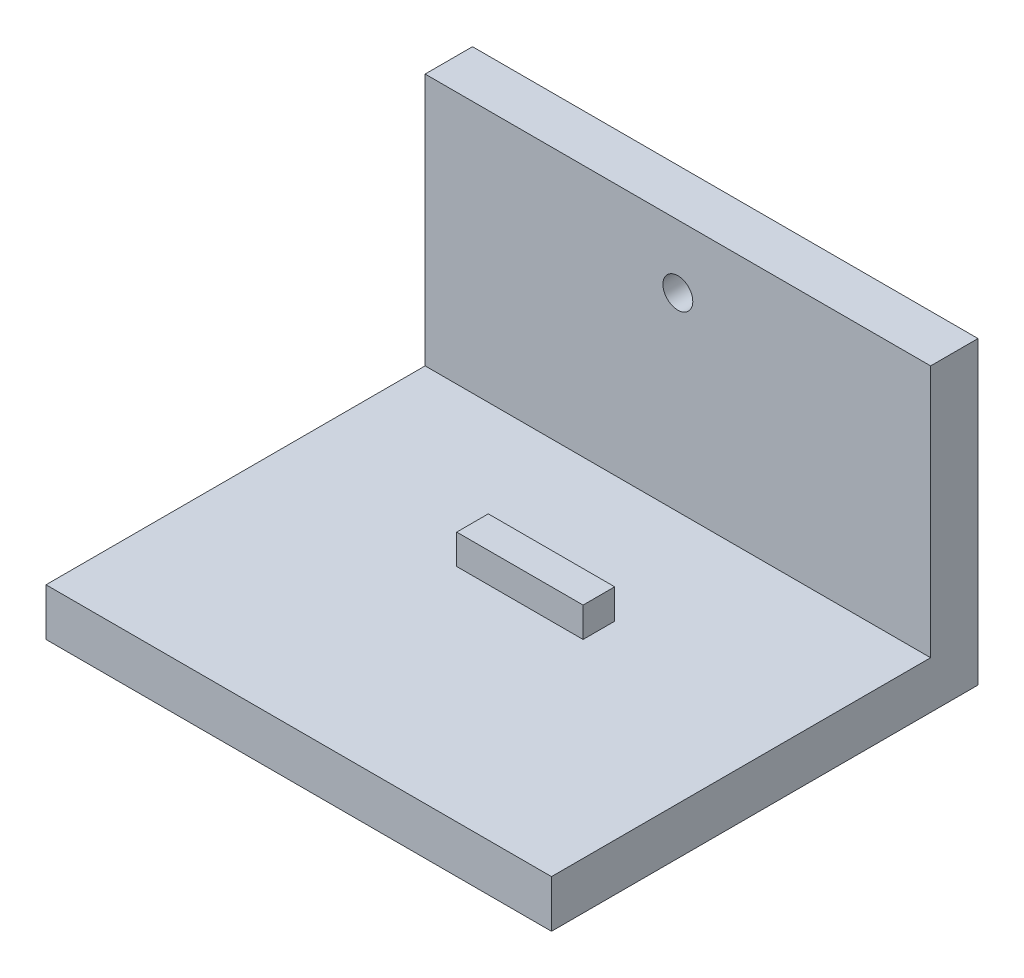
ISO-10303-21;
HEADER;
FILE_DESCRIPTION(('STEP AP214'),'2;1');
FILE_NAME('part.step','',(''),(''),'','','');
FILE_SCHEMA(('AUTOMOTIVE_DESIGN { 1 0 10303 214 1 1 1 1 }'));
ENDSEC;
DATA;
#1=APPLICATION_CONTEXT('core data for automotive mechanical design processes');
#2=APPLICATION_PROTOCOL_DEFINITION('international standard','automotive_design',2000,#1);
#3=PRODUCT_CONTEXT('',#1,'mechanical');
#4=PRODUCT('Part','Part','',(#3));
#5=PRODUCT_RELATED_PRODUCT_CATEGORY('part','',(#4));
#6=PRODUCT_DEFINITION_FORMATION('','',#4);
#7=PRODUCT_DEFINITION_CONTEXT('part definition',#1,'design');
#8=PRODUCT_DEFINITION('design','',#6,#7);
#9=PRODUCT_DEFINITION_SHAPE('','',#8);
#10=(LENGTH_UNIT() NAMED_UNIT(*) SI_UNIT(.MILLI.,.METRE.));
#11=(NAMED_UNIT(*) PLANE_ANGLE_UNIT() SI_UNIT($,.RADIAN.));
#12=(NAMED_UNIT(*) SI_UNIT($,.STERADIAN.) SOLID_ANGLE_UNIT());
#13=UNCERTAINTY_MEASURE_WITH_UNIT(LENGTH_MEASURE(1.E-05),#10,'distance_accuracy_value','');
#14=(GEOMETRIC_REPRESENTATION_CONTEXT(3) GLOBAL_UNCERTAINTY_ASSIGNED_CONTEXT((#13)) GLOBAL_UNIT_ASSIGNED_CONTEXT((#10,
#11,#12)) REPRESENTATION_CONTEXT('',''));
#15=CARTESIAN_POINT('',(0.,0.,0.));
#16=DIRECTION('',(0.,0.,1.));
#17=DIRECTION('',(1.,0.,0.));
#18=AXIS2_PLACEMENT_3D('',#15,#16,#17);
#19=CARTESIAN_POINT('',(50.8,4.7625,42.8625));
#20=DIRECTION('',(0.,-1.,0.));
#21=DIRECTION('',(0.,0.,-1.));
#22=AXIS2_PLACEMENT_3D('',#19,#20,#21);
#23=PLANE('',#22);
#24=DIRECTION('',(0.,0.,1.));
#25=VECTOR('',#24,1.);
#26=CARTESIAN_POINT('',(0.,4.7625,42.8625));
#27=LINE('',#26,#25);
#28=CARTESIAN_POINT('',(0.,4.7625,4.7625));
#29=VERTEX_POINT('',#28);
#30=CARTESIAN_POINT('',(0.,4.7625,42.8625));
#31=VERTEX_POINT('',#30);
#32=EDGE_CURVE('E178',#29,#31,#27,.T.);
#33=ORIENTED_EDGE('',*,*,#32,.T.);
#34=DIRECTION('',(-1.,0.,0.));
#35=VECTOR('',#34,1.);
#36=CARTESIAN_POINT('',(50.8,4.7625,42.8625));
#37=LINE('',#36,#35);
#38=CARTESIAN_POINT('',(50.8,4.7625,42.8625));
#39=VERTEX_POINT('',#38);
#40=EDGE_CURVE('E193',#39,#31,#37,.T.);
#41=ORIENTED_EDGE('',*,*,#40,.F.);
#42=DIRECTION('',(0.,0.,1.));
#43=VECTOR('',#42,1.);
#44=CARTESIAN_POINT('',(50.8,4.7625,42.8625));
#45=LINE('',#44,#43);
#46=CARTESIAN_POINT('',(50.8,4.7625,4.7625));
#47=VERTEX_POINT('',#46);
#48=EDGE_CURVE('E163',#47,#39,#45,.T.);
#49=ORIENTED_EDGE('',*,*,#48,.F.);
#50=DIRECTION('',(-1.,0.,0.));
#51=VECTOR('',#50,1.);
#52=CARTESIAN_POINT('',(50.8,4.7625,4.7625));
#53=LINE('',#52,#51);
#54=EDGE_CURVE('E197',#47,#29,#53,.T.);
#55=ORIENTED_EDGE('',*,*,#54,.T.);
#56=EDGE_LOOP('',(#33,#41,#49,#55));
#57=FACE_BOUND('',#56,.T.);
#58=DIRECTION('',(0.,0.,1.));
#59=VECTOR('',#58,1.);
#60=CARTESIAN_POINT('',(19.05,4.7625,20.6375));
#61=LINE('',#60,#59);
#62=CARTESIAN_POINT('',(19.05,4.7625,17.4625));
#63=VERTEX_POINT('',#62);
#64=CARTESIAN_POINT('',(19.05,4.7625,20.6375));
#65=VERTEX_POINT('',#64);
#66=EDGE_CURVE('E139',#63,#65,#61,.T.);
#67=ORIENTED_EDGE('',*,*,#66,.F.);
#68=DIRECTION('',(-1.,0.,0.));
#69=VECTOR('',#68,1.);
#70=CARTESIAN_POINT('',(19.05,4.7625,17.4625));
#71=LINE('',#70,#69);
#72=CARTESIAN_POINT('',(31.75,4.7625,17.4625));
#73=VERTEX_POINT('',#72);
#74=EDGE_CURVE('E136',#73,#63,#71,.T.);
#75=ORIENTED_EDGE('',*,*,#74,.F.);
#76=DIRECTION('',(0.,0.,-1.));
#77=VECTOR('',#76,1.);
#78=CARTESIAN_POINT('',(31.75,4.7625,20.6375));
#79=LINE('',#78,#77);
#80=CARTESIAN_POINT('',(31.75,4.7625,20.6375));
#81=VERTEX_POINT('',#80);
#82=EDGE_CURVE('E60',#81,#73,#79,.T.);
#83=ORIENTED_EDGE('',*,*,#82,.F.);
#84=DIRECTION('',(1.,0.,0.));
#85=VECTOR('',#84,1.);
#86=CARTESIAN_POINT('',(19.05,4.7625,20.6375));
#87=LINE('',#86,#85);
#88=EDGE_CURVE('E55',#65,#81,#87,.T.);
#89=ORIENTED_EDGE('',*,*,#88,.F.);
#90=EDGE_LOOP('',(#67,#75,#83,#89));
#91=FACE_BOUND('',#90,.T.);
#92=ADVANCED_FACE('F39',(#57,#91),#23,.F.);
#93=CARTESIAN_POINT('',(50.8,30.1625,0.));
#94=DIRECTION('',(0.,0.,1.));
#95=DIRECTION('',(0.,-1.,0.));
#96=AXIS2_PLACEMENT_3D('',#93,#94,#95);
#97=PLANE('',#96);
#98=CARTESIAN_POINT('',(25.4,23.8125,0.));
#99=DIRECTION('',(0.,0.,1.));
#100=DIRECTION('',(1.,0.,0.));
#101=AXIS2_PLACEMENT_3D('',#98,#99,#100);
#102=CIRCLE('',#101,1.499997);
#103=CARTESIAN_POINT('',(26.899997,23.8125,0.));
#104=VERTEX_POINT('',#103);
#105=EDGE_CURVE('E353',#104,#104,#102,.T.);
#106=ORIENTED_EDGE('',*,*,#105,.T.);
#107=EDGE_LOOP('',(#106));
#108=FACE_BOUND('',#107,.T.);
#109=DIRECTION('',(0.,1.,0.));
#110=VECTOR('',#109,1.);
#111=CARTESIAN_POINT('',(0.,30.1625,0.));
#112=LINE('',#111,#110);
#113=CARTESIAN_POINT('',(0.,0.,0.));
#114=VERTEX_POINT('',#113);
#115=CARTESIAN_POINT('',(0.,30.1625,0.));
#116=VERTEX_POINT('',#115);
#117=EDGE_CURVE('E141',#114,#116,#112,.T.);
#118=ORIENTED_EDGE('',*,*,#117,.T.);
#119=DIRECTION('',(-1.,0.,0.));
#120=VECTOR('',#119,1.);
#121=CARTESIAN_POINT('',(50.8,30.1625,0.));
#122=LINE('',#121,#120);
#123=CARTESIAN_POINT('',(50.8,30.1625,0.));
#124=VERTEX_POINT('',#123);
#125=EDGE_CURVE('E11',#124,#116,#122,.T.);
#126=ORIENTED_EDGE('',*,*,#125,.F.);
#127=DIRECTION('',(0.,1.,0.));
#128=VECTOR('',#127,1.);
#129=CARTESIAN_POINT('',(50.8,30.1625,0.));
#130=LINE('',#129,#128);
#131=CARTESIAN_POINT('',(50.8,0.,0.));
#132=VERTEX_POINT('',#131);
#133=EDGE_CURVE('E152',#132,#124,#130,.T.);
#134=ORIENTED_EDGE('',*,*,#133,.F.);
#135=DIRECTION('',(-1.,0.,0.));
#136=VECTOR('',#135,1.);
#137=CARTESIAN_POINT('',(50.8,0.,0.));
#138=LINE('',#137,#136);
#139=EDGE_CURVE('E171',#132,#114,#138,.T.);
#140=ORIENTED_EDGE('',*,*,#139,.T.);
#141=EDGE_LOOP('',(#118,#126,#134,#140));
#142=FACE_BOUND('',#141,.T.);
#143=ADVANCED_FACE('F41',(#108,#142),#97,.F.);
#144=CARTESIAN_POINT('',(50.8,30.1625,4.7625));
#145=DIRECTION('',(0.,-1.,0.));
#146=DIRECTION('',(0.,0.,-1.));
#147=AXIS2_PLACEMENT_3D('',#144,#145,#146);
#148=PLANE('',#147);
#149=DIRECTION('',(0.,0.,1.));
#150=VECTOR('',#149,1.);
#151=CARTESIAN_POINT('',(0.,30.1625,4.7625));
#152=LINE('',#151,#150);
#153=CARTESIAN_POINT('',(0.,30.1625,4.7625));
#154=VERTEX_POINT('',#153);
#155=EDGE_CURVE('E146',#116,#154,#152,.T.);
#156=ORIENTED_EDGE('',*,*,#155,.T.);
#157=DIRECTION('',(-1.,0.,0.));
#158=VECTOR('',#157,1.);
#159=CARTESIAN_POINT('',(50.8,30.1625,4.7625));
#160=LINE('',#159,#158);
#161=CARTESIAN_POINT('',(50.8,30.1625,4.7625));
#162=VERTEX_POINT('',#161);
#163=EDGE_CURVE('E48',#162,#154,#160,.T.);
#164=ORIENTED_EDGE('',*,*,#163,.F.);
#165=DIRECTION('',(0.,0.,1.));
#166=VECTOR('',#165,1.);
#167=CARTESIAN_POINT('',(50.8,30.1625,4.7625));
#168=LINE('',#167,#166);
#169=EDGE_CURVE('E156',#124,#162,#168,.T.);
#170=ORIENTED_EDGE('',*,*,#169,.F.);
#171=ORIENTED_EDGE('',*,*,#125,.T.);
#172=EDGE_LOOP('',(#156,#164,#170,#171));
#173=FACE_BOUND('',#172,.T.);
#174=ADVANCED_FACE('F228',(#173),#148,.F.);
#175=CARTESIAN_POINT('',(50.8,4.7625,4.7625));
#176=DIRECTION('',(0.,0.,-1.));
#177=DIRECTION('',(0.,1.,0.));
#178=AXIS2_PLACEMENT_3D('',#175,#176,#177);
#179=PLANE('',#178);
#180=CARTESIAN_POINT('',(25.4,23.8125,4.7625));
#181=DIRECTION('',(0.,0.,1.));
#182=DIRECTION('',(1.,0.,0.));
#183=AXIS2_PLACEMENT_3D('',#180,#181,#182);
#184=CIRCLE('',#183,1.499997);
#185=CARTESIAN_POINT('',(26.899997,23.8125,4.7625));
#186=VERTEX_POINT('',#185);
#187=EDGE_CURVE('E356',#186,#186,#184,.T.);
#188=ORIENTED_EDGE('',*,*,#187,.F.);
#189=EDGE_LOOP('',(#188));
#190=FACE_BOUND('',#189,.T.);
#191=DIRECTION('',(0.,-1.,0.));
#192=VECTOR('',#191,1.);
#193=CARTESIAN_POINT('',(0.,4.7625,4.7625));
#194=LINE('',#193,#192);
#195=EDGE_CURVE('E175',#154,#29,#194,.T.);
#196=ORIENTED_EDGE('',*,*,#195,.T.);
#197=ORIENTED_EDGE('',*,*,#54,.F.);
#198=DIRECTION('',(0.,-1.,0.));
#199=VECTOR('',#198,1.);
#200=CARTESIAN_POINT('',(50.8,4.7625,4.7625));
#201=LINE('',#200,#199);
#202=EDGE_CURVE('E160',#162,#47,#201,.T.);
#203=ORIENTED_EDGE('',*,*,#202,.F.);
#204=ORIENTED_EDGE('',*,*,#163,.T.);
#205=EDGE_LOOP('',(#196,#197,#203,#204));
#206=FACE_BOUND('',#205,.T.);
#207=ADVANCED_FACE('F206',(#190,#206),#179,.F.);
#208=CARTESIAN_POINT('',(50.8,0.,42.8625));
#209=DIRECTION('',(0.,0.,-1.));
#210=DIRECTION('',(-1.,0.,0.));
#211=AXIS2_PLACEMENT_3D('',#208,#209,#210);
#212=PLANE('',#211);
#213=DIRECTION('',(0.,-1.,0.));
#214=VECTOR('',#213,1.);
#215=CARTESIAN_POINT('',(0.,0.,42.8625));
#216=LINE('',#215,#214);
#217=CARTESIAN_POINT('',(0.,0.,42.8625));
#218=VERTEX_POINT('',#217);
#219=EDGE_CURVE('E181',#31,#218,#216,.T.);
#220=ORIENTED_EDGE('',*,*,#219,.T.);
#221=DIRECTION('',(-1.,0.,0.));
#222=VECTOR('',#221,1.);
#223=CARTESIAN_POINT('',(50.8,0.,42.8625));
#224=LINE('',#223,#222);
#225=CARTESIAN_POINT('',(50.8,0.,42.8625));
#226=VERTEX_POINT('',#225);
#227=EDGE_CURVE('E189',#226,#218,#224,.T.);
#228=ORIENTED_EDGE('',*,*,#227,.F.);
#229=DIRECTION('',(0.,-1.,0.));
#230=VECTOR('',#229,1.);
#231=CARTESIAN_POINT('',(50.8,0.,42.8625));
#232=LINE('',#231,#230);
#233=EDGE_CURVE('E166',#39,#226,#232,.T.);
#234=ORIENTED_EDGE('',*,*,#233,.F.);
#235=ORIENTED_EDGE('',*,*,#40,.T.);
#236=EDGE_LOOP('',(#220,#228,#234,#235));
#237=FACE_BOUND('',#236,.T.);
#238=ADVANCED_FACE('F220',(#237),#212,.F.);
#239=CARTESIAN_POINT('',(50.8,0.,0.));
#240=DIRECTION('',(0.,1.,0.));
#241=DIRECTION('',(0.,0.,1.));
#242=AXIS2_PLACEMENT_3D('',#239,#240,#241);
#243=PLANE('',#242);
#244=DIRECTION('',(0.,0.,-1.));
#245=VECTOR('',#244,1.);
#246=CARTESIAN_POINT('',(0.,0.,0.));
#247=LINE('',#246,#245);
#248=EDGE_CURVE('E157',#218,#114,#247,.T.);
#249=ORIENTED_EDGE('',*,*,#248,.T.);
#250=ORIENTED_EDGE('',*,*,#139,.F.);
#251=DIRECTION('',(0.,0.,-1.));
#252=VECTOR('',#251,1.);
#253=CARTESIAN_POINT('',(50.8,0.,0.));
#254=LINE('',#253,#252);
#255=EDGE_CURVE('E169',#226,#132,#254,.T.);
#256=ORIENTED_EDGE('',*,*,#255,.F.);
#257=ORIENTED_EDGE('',*,*,#227,.T.);
#258=EDGE_LOOP('',(#249,#250,#256,#257));
#259=FACE_BOUND('',#258,.T.);
#260=ADVANCED_FACE('F231',(#259),#243,.F.);
#261=CARTESIAN_POINT('',(50.8,0.,0.));
#262=DIRECTION('',(-1.,0.,0.));
#263=DIRECTION('',(0.,0.,1.));
#264=AXIS2_PLACEMENT_3D('',#261,#262,#263);
#265=PLANE('',#264);
#266=ORIENTED_EDGE('',*,*,#133,.T.);
#267=ORIENTED_EDGE('',*,*,#169,.T.);
#268=ORIENTED_EDGE('',*,*,#202,.T.);
#269=ORIENTED_EDGE('',*,*,#48,.T.);
#270=ORIENTED_EDGE('',*,*,#233,.T.);
#271=ORIENTED_EDGE('',*,*,#255,.T.);
#272=EDGE_LOOP('',(#266,#267,#268,#269,#270,#271));
#273=FACE_BOUND('',#272,.T.);
#274=ADVANCED_FACE('F224',(#273),#265,.F.);
#275=CARTESIAN_POINT('',(0.,0.,0.));
#276=DIRECTION('',(-1.,0.,0.));
#277=DIRECTION('',(0.,0.,1.));
#278=AXIS2_PLACEMENT_3D('',#275,#276,#277);
#279=PLANE('',#278);
#280=ORIENTED_EDGE('',*,*,#117,.F.);
#281=ORIENTED_EDGE('',*,*,#248,.F.);
#282=ORIENTED_EDGE('',*,*,#219,.F.);
#283=ORIENTED_EDGE('',*,*,#32,.F.);
#284=ORIENTED_EDGE('',*,*,#195,.F.);
#285=ORIENTED_EDGE('',*,*,#155,.F.);
#286=EDGE_LOOP('',(#280,#281,#282,#283,#284,#285));
#287=FACE_BOUND('',#286,.T.);
#288=ADVANCED_FACE('F212',(#287),#279,.T.);
#289=CARTESIAN_POINT('',(19.05,7.7597,20.6375));
#290=DIRECTION('',(1.,0.,0.));
#291=DIRECTION('',(0.,0.,-1.));
#292=AXIS2_PLACEMENT_3D('',#289,#290,#291);
#293=PLANE('',#292);
#294=ORIENTED_EDGE('',*,*,#66,.T.);
#295=DIRECTION('',(0.,-1.,0.));
#296=VECTOR('',#295,1.);
#297=CARTESIAN_POINT('',(19.05,7.7597,20.6375));
#298=LINE('',#297,#296);
#299=CARTESIAN_POINT('',(19.05,7.7597,20.6375));
#300=VERTEX_POINT('',#299);
#301=EDGE_CURVE('E118',#300,#65,#298,.T.);
#302=ORIENTED_EDGE('',*,*,#301,.F.);
#303=DIRECTION('',(0.,0.,1.));
#304=VECTOR('',#303,1.);
#305=CARTESIAN_POINT('',(19.05,7.7597,20.6375));
#306=LINE('',#305,#304);
#307=CARTESIAN_POINT('',(19.05,7.7597,17.4625));
#308=VERTEX_POINT('',#307);
#309=EDGE_CURVE('E126',#308,#300,#306,.T.);
#310=ORIENTED_EDGE('',*,*,#309,.F.);
#311=DIRECTION('',(0.,-1.,0.));
#312=VECTOR('',#311,1.);
#313=CARTESIAN_POINT('',(19.05,7.7597,17.4625));
#314=LINE('',#313,#312);
#315=EDGE_CURVE('E366',#308,#63,#314,.T.);
#316=ORIENTED_EDGE('',*,*,#315,.T.);
#317=EDGE_LOOP('',(#294,#302,#310,#316));
#318=FACE_BOUND('',#317,.T.);
#319=ADVANCED_FACE('F138',(#318),#293,.F.);
#320=CARTESIAN_POINT('',(19.05,7.7597,20.6375));
#321=DIRECTION('',(0.,0.,-1.));
#322=DIRECTION('',(0.,1.,0.));
#323=AXIS2_PLACEMENT_3D('',#320,#321,#322);
#324=PLANE('',#323);
#325=ORIENTED_EDGE('',*,*,#88,.T.);
#326=DIRECTION('',(0.,-1.,0.));
#327=VECTOR('',#326,1.);
#328=CARTESIAN_POINT('',(31.75,7.7597,20.6375));
#329=LINE('',#328,#327);
#330=CARTESIAN_POINT('',(31.75,7.7597,20.6375));
#331=VERTEX_POINT('',#330);
#332=EDGE_CURVE('E121',#331,#81,#329,.T.);
#333=ORIENTED_EDGE('',*,*,#332,.F.);
#334=DIRECTION('',(1.,0.,0.));
#335=VECTOR('',#334,1.);
#336=CARTESIAN_POINT('',(19.05,7.7597,20.6375));
#337=LINE('',#336,#335);
#338=EDGE_CURVE('E114',#300,#331,#337,.T.);
#339=ORIENTED_EDGE('',*,*,#338,.F.);
#340=ORIENTED_EDGE('',*,*,#301,.T.);
#341=EDGE_LOOP('',(#325,#333,#339,#340));
#342=FACE_BOUND('',#341,.T.);
#343=ADVANCED_FACE('F116',(#342),#324,.F.);
#344=CARTESIAN_POINT('',(31.75,7.7597,20.6375));
#345=DIRECTION('',(-1.,0.,0.));
#346=DIRECTION('',(0.,0.,1.));
#347=AXIS2_PLACEMENT_3D('',#344,#345,#346);
#348=PLANE('',#347);
#349=ORIENTED_EDGE('',*,*,#82,.T.);
#350=DIRECTION('',(0.,-1.,0.));
#351=VECTOR('',#350,1.);
#352=CARTESIAN_POINT('',(31.75,7.7597,17.4625));
#353=LINE('',#352,#351);
#354=CARTESIAN_POINT('',(31.75,7.7597,17.4625));
#355=VERTEX_POINT('',#354);
#356=EDGE_CURVE('E148',#355,#73,#353,.T.);
#357=ORIENTED_EDGE('',*,*,#356,.F.);
#358=DIRECTION('',(0.,0.,-1.));
#359=VECTOR('',#358,1.);
#360=CARTESIAN_POINT('',(31.75,7.7597,20.6375));
#361=LINE('',#360,#359);
#362=EDGE_CURVE('E125',#331,#355,#361,.T.);
#363=ORIENTED_EDGE('',*,*,#362,.F.);
#364=ORIENTED_EDGE('',*,*,#332,.T.);
#365=EDGE_LOOP('',(#349,#357,#363,#364));
#366=FACE_BOUND('',#365,.T.);
#367=ADVANCED_FACE('F302',(#366),#348,.F.);
#368=CARTESIAN_POINT('',(19.05,7.7597,17.4625));
#369=DIRECTION('',(0.,0.,1.));
#370=DIRECTION('',(0.,-1.,0.));
#371=AXIS2_PLACEMENT_3D('',#368,#369,#370);
#372=PLANE('',#371);
#373=ORIENTED_EDGE('',*,*,#74,.T.);
#374=ORIENTED_EDGE('',*,*,#315,.F.);
#375=DIRECTION('',(-1.,0.,0.));
#376=VECTOR('',#375,1.);
#377=CARTESIAN_POINT('',(19.05,7.7597,17.4625));
#378=LINE('',#377,#376);
#379=EDGE_CURVE('E131',#355,#308,#378,.T.);
#380=ORIENTED_EDGE('',*,*,#379,.F.);
#381=ORIENTED_EDGE('',*,*,#356,.T.);
#382=EDGE_LOOP('',(#373,#374,#380,#381));
#383=FACE_BOUND('',#382,.T.);
#384=ADVANCED_FACE('F311',(#383),#372,.F.);
#385=CARTESIAN_POINT('',(0.,7.7597,0.));
#386=DIRECTION('',(0.,-1.,0.));
#387=DIRECTION('',(0.,0.,-1.));
#388=AXIS2_PLACEMENT_3D('',#385,#386,#387);
#389=PLANE('',#388);
#390=ORIENTED_EDGE('',*,*,#309,.T.);
#391=ORIENTED_EDGE('',*,*,#338,.T.);
#392=ORIENTED_EDGE('',*,*,#362,.T.);
#393=ORIENTED_EDGE('',*,*,#379,.T.);
#394=EDGE_LOOP('',(#390,#391,#392,#393));
#395=FACE_BOUND('',#394,.T.);
#396=ADVANCED_FACE('F129',(#395),#389,.F.);
#397=CARTESIAN_POINT('',(25.4,23.8125,0.));
#398=DIRECTION('',(0.,0.,1.));
#399=DIRECTION('',(1.,0.,0.));
#400=AXIS2_PLACEMENT_3D('',#397,#398,#399);
#401=CYLINDRICAL_SURFACE('',#400,1.499997);
#402=ORIENTED_EDGE('',*,*,#105,.F.);
#403=EDGE_LOOP('',(#402));
#404=FACE_BOUND('',#403,.T.);
#405=ORIENTED_EDGE('',*,*,#187,.T.);
#406=EDGE_LOOP('',(#405));
#407=FACE_BOUND('',#406,.T.);
#408=ADVANCED_FACE('F329',(#404,#407),#401,.F.);
#409=CLOSED_SHELL('',(#92,#143,#174,#207,#238,#260,#274,#288,#319,#343,#367,#384,#396,#408));
#410=MANIFOLD_SOLID_BREP('B2',#409);
#411=ADVANCED_BREP_SHAPE_REPRESENTATION('',(#18,#410),#14);
#412=SHAPE_DEFINITION_REPRESENTATION(#9,#411);
ENDSEC;
END-ISO-10303-21;
